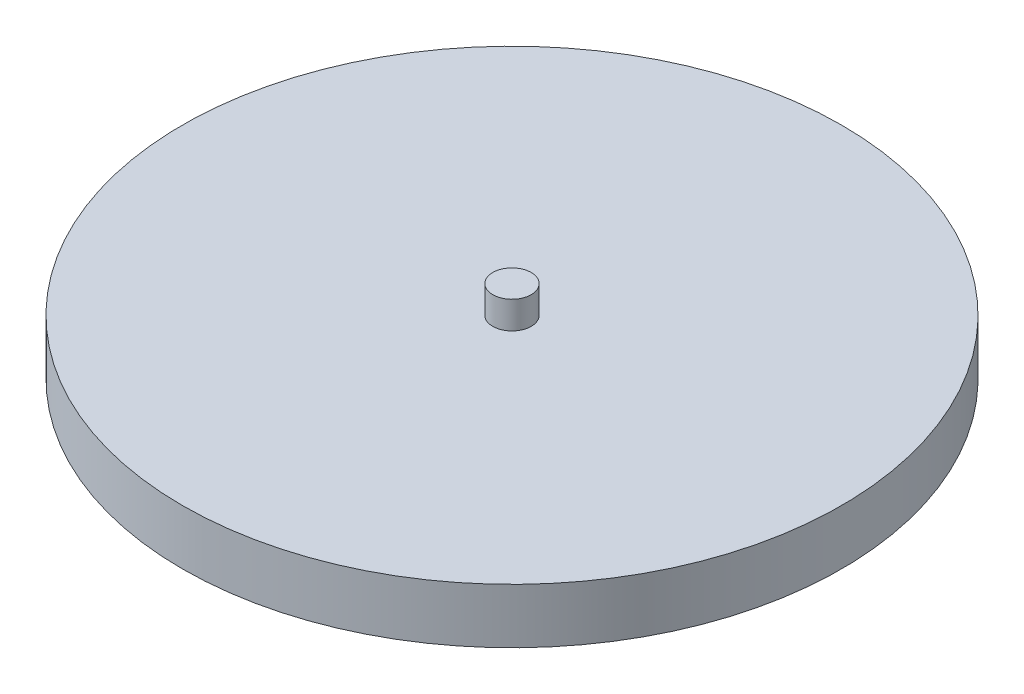
ISO-10303-21;
HEADER;
FILE_DESCRIPTION(('STEP AP214'),'2;1');
FILE_NAME('part.step','',(''),(''),'','','');
FILE_SCHEMA(('AUTOMOTIVE_DESIGN { 1 0 10303 214 1 1 1 1 }'));
ENDSEC;
DATA;
#1=APPLICATION_CONTEXT('core data for automotive mechanical design processes');
#2=APPLICATION_PROTOCOL_DEFINITION('international standard','automotive_design',2000,#1);
#3=PRODUCT_CONTEXT('',#1,'mechanical');
#4=PRODUCT('Part','Part','',(#3));
#5=PRODUCT_RELATED_PRODUCT_CATEGORY('part','',(#4));
#6=PRODUCT_DEFINITION_FORMATION('','',#4);
#7=PRODUCT_DEFINITION_CONTEXT('part definition',#1,'design');
#8=PRODUCT_DEFINITION('design','',#6,#7);
#9=PRODUCT_DEFINITION_SHAPE('','',#8);
#10=(LENGTH_UNIT() NAMED_UNIT(*) SI_UNIT(.MILLI.,.METRE.));
#11=(NAMED_UNIT(*) PLANE_ANGLE_UNIT() SI_UNIT($,.RADIAN.));
#12=(NAMED_UNIT(*) SI_UNIT($,.STERADIAN.) SOLID_ANGLE_UNIT());
#13=UNCERTAINTY_MEASURE_WITH_UNIT(LENGTH_MEASURE(1.E-05),#10,'distance_accuracy_value','');
#14=(GEOMETRIC_REPRESENTATION_CONTEXT(3) GLOBAL_UNCERTAINTY_ASSIGNED_CONTEXT((#13)) GLOBAL_UNIT_ASSIGNED_CONTEXT((#10,
#11,#12)) REPRESENTATION_CONTEXT('',''));
#15=CARTESIAN_POINT('',(0.,0.,0.));
#16=DIRECTION('',(0.,0.,1.));
#17=DIRECTION('',(1.,0.,0.));
#18=AXIS2_PLACEMENT_3D('',#15,#16,#17);
#19=CARTESIAN_POINT('',(0.,10.,0.));
#20=DIRECTION('',(0.,1.,0.));
#21=DIRECTION('',(0.,0.,1.));
#22=AXIS2_PLACEMENT_3D('',#19,#20,#21);
#23=PLANE('',#22);
#24=CARTESIAN_POINT('',(0.,10.,0.));
#25=DIRECTION('',(0.,1.,0.));
#26=DIRECTION('',(0.,0.,1.));
#27=AXIS2_PLACEMENT_3D('',#24,#25,#26);
#28=CIRCLE('',#27,60.);
#29=CARTESIAN_POINT('',(0.,10.,60.));
#30=VERTEX_POINT('',#29);
#31=EDGE_CURVE('E10',#30,#30,#28,.T.);
#32=ORIENTED_EDGE('',*,*,#31,.T.);
#33=EDGE_LOOP('',(#32));
#34=FACE_BOUND('',#33,.T.);
#35=CARTESIAN_POINT('',(0.,10.,0.));
#36=DIRECTION('',(0.,1.,0.));
#37=DIRECTION('',(0.,0.,1.));
#38=AXIS2_PLACEMENT_3D('',#35,#36,#37);
#39=CIRCLE('',#38,3.5);
#40=CARTESIAN_POINT('',(0.,10.,3.5));
#41=VERTEX_POINT('',#40);
#42=EDGE_CURVE('E43',#41,#41,#39,.T.);
#43=ORIENTED_EDGE('',*,*,#42,.F.);
#44=EDGE_LOOP('',(#43));
#45=FACE_BOUND('',#44,.T.);
#46=ADVANCED_FACE('F30',(#34,#45),#23,.T.);
#47=CARTESIAN_POINT('',(0.,10.,0.));
#48=DIRECTION('',(0.,-1.,0.));
#49=DIRECTION('',(0.,0.,-1.));
#50=AXIS2_PLACEMENT_3D('',#47,#48,#49);
#51=CYLINDRICAL_SURFACE('',#50,60.);
#52=ORIENTED_EDGE('',*,*,#31,.F.);
#53=EDGE_LOOP('',(#52));
#54=FACE_BOUND('',#53,.T.);
#55=CARTESIAN_POINT('',(0.,0.,0.));
#56=DIRECTION('',(0.,1.,0.));
#57=DIRECTION('',(0.,0.,1.));
#58=AXIS2_PLACEMENT_3D('',#55,#56,#57);
#59=CIRCLE('',#58,60.);
#60=CARTESIAN_POINT('',(0.,0.,60.));
#61=VERTEX_POINT('',#60);
#62=EDGE_CURVE('E34',#61,#61,#59,.T.);
#63=ORIENTED_EDGE('',*,*,#62,.T.);
#64=EDGE_LOOP('',(#63));
#65=FACE_BOUND('',#64,.T.);
#66=ADVANCED_FACE('F32',(#54,#65),#51,.T.);
#67=CARTESIAN_POINT('',(0.,0.,0.));
#68=DIRECTION('',(0.,1.,0.));
#69=DIRECTION('',(0.,0.,1.));
#70=AXIS2_PLACEMENT_3D('',#67,#68,#69);
#71=PLANE('',#70);
#72=ORIENTED_EDGE('',*,*,#62,.F.);
#73=EDGE_LOOP('',(#72));
#74=FACE_BOUND('',#73,.T.);
#75=ADVANCED_FACE('F54',(#74),#71,.F.);
#76=CARTESIAN_POINT('',(0.,15.,0.));
#77=DIRECTION('',(0.,-1.,0.));
#78=DIRECTION('',(0.,0.,-1.));
#79=AXIS2_PLACEMENT_3D('',#76,#77,#78);
#80=CYLINDRICAL_SURFACE('',#79,3.5);
#81=CARTESIAN_POINT('',(0.,15.,0.));
#82=DIRECTION('',(0.,1.,0.));
#83=DIRECTION('',(0.,0.,1.));
#84=AXIS2_PLACEMENT_3D('',#81,#82,#83);
#85=CIRCLE('',#84,3.5);
#86=CARTESIAN_POINT('',(0.,15.,3.5));
#87=VERTEX_POINT('',#86);
#88=EDGE_CURVE('E41',#87,#87,#85,.T.);
#89=ORIENTED_EDGE('',*,*,#88,.F.);
#90=EDGE_LOOP('',(#89));
#91=FACE_BOUND('',#90,.T.);
#92=ORIENTED_EDGE('',*,*,#42,.T.);
#93=EDGE_LOOP('',(#92));
#94=FACE_BOUND('',#93,.T.);
#95=ADVANCED_FACE('F51',(#91,#94),#80,.T.);
#96=CARTESIAN_POINT('',(0.,15.,0.));
#97=DIRECTION('',(0.,1.,0.));
#98=DIRECTION('',(0.,0.,1.));
#99=AXIS2_PLACEMENT_3D('',#96,#97,#98);
#100=PLANE('',#99);
#101=ORIENTED_EDGE('',*,*,#88,.T.);
#102=EDGE_LOOP('',(#101));
#103=FACE_BOUND('',#102,.T.);
#104=ADVANCED_FACE('F49',(#103),#100,.T.);
#105=CLOSED_SHELL('',(#46,#66,#75,#95,#104));
#106=MANIFOLD_SOLID_BREP('B2',#105);
#107=ADVANCED_BREP_SHAPE_REPRESENTATION('',(#18,#106),#14);
#108=SHAPE_DEFINITION_REPRESENTATION(#9,#107);
ENDSEC;
END-ISO-10303-21;
